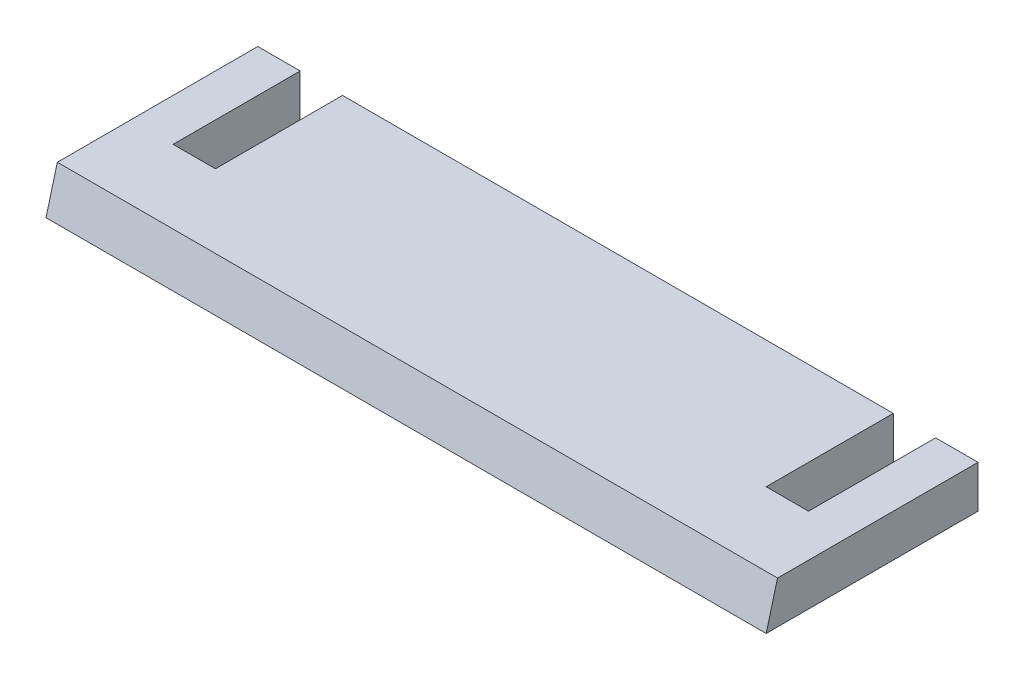
ISO-10303-21;
HEADER;
FILE_DESCRIPTION(('STEP AP214'),'2;1');
FILE_NAME('part.step','',(''),(''),'','','');
FILE_SCHEMA(('AUTOMOTIVE_DESIGN { 1 0 10303 214 1 1 1 1 }'));
ENDSEC;
DATA;
#1=APPLICATION_CONTEXT('core data for automotive mechanical design processes');
#2=APPLICATION_PROTOCOL_DEFINITION('international standard','automotive_design',2000,#1);
#3=PRODUCT_CONTEXT('',#1,'mechanical');
#4=PRODUCT('Part','Part','',(#3));
#5=PRODUCT_RELATED_PRODUCT_CATEGORY('part','',(#4));
#6=PRODUCT_DEFINITION_FORMATION('','',#4);
#7=PRODUCT_DEFINITION_CONTEXT('part definition',#1,'design');
#8=PRODUCT_DEFINITION('design','',#6,#7);
#9=PRODUCT_DEFINITION_SHAPE('','',#8);
#10=(LENGTH_UNIT() NAMED_UNIT(*) SI_UNIT(.MILLI.,.METRE.));
#11=(NAMED_UNIT(*) PLANE_ANGLE_UNIT() SI_UNIT($,.RADIAN.));
#12=(NAMED_UNIT(*) SI_UNIT($,.STERADIAN.) SOLID_ANGLE_UNIT());
#13=UNCERTAINTY_MEASURE_WITH_UNIT(LENGTH_MEASURE(1.E-05),#10,'distance_accuracy_value','');
#14=(GEOMETRIC_REPRESENTATION_CONTEXT(3) GLOBAL_UNCERTAINTY_ASSIGNED_CONTEXT((#13)) GLOBAL_UNIT_ASSIGNED_CONTEXT((#10,
#11,#12)) REPRESENTATION_CONTEXT('',''));
#15=CARTESIAN_POINT('',(0.,0.,0.));
#16=DIRECTION('',(0.,0.,1.));
#17=DIRECTION('',(1.,0.,0.));
#18=AXIS2_PLACEMENT_3D('',#15,#16,#17);
#19=CARTESIAN_POINT('',(170.,0.,0.));
#20=DIRECTION('',(0.,0.258819045102521,0.965925826289068));
#21=DIRECTION('',(0.,-0.965925826289068,0.258819045102521));
#22=AXIS2_PLACEMENT_3D('',#19,#20,#21);
#23=PLANE('',#22);
#24=DIRECTION('',(1.,0.,0.));
#25=VECTOR('',#24,1.);
#26=CARTESIAN_POINT('',(170.,0.,0.));
#27=LINE('',#26,#25);
#28=CARTESIAN_POINT('',(0.,0.,0.));
#29=VERTEX_POINT('',#28);
#30=CARTESIAN_POINT('',(170.,0.,0.));
#31=VERTEX_POINT('',#30);
#32=EDGE_CURVE('E132',#29,#31,#27,.T.);
#33=ORIENTED_EDGE('',*,*,#32,.T.);
#34=DIRECTION('',(0.,0.965925826289068,-0.258819045102521));
#35=VECTOR('',#34,1.);
#36=CARTESIAN_POINT('',(170.,21.8301270189222,-5.84936490538906));
#37=LINE('',#36,#35);
#38=CARTESIAN_POINT('',(170.,10.,-2.67949192431124));
#39=VERTEX_POINT('',#38);
#40=EDGE_CURVE('E11',#39,#31,#37,.F.);
#41=ORIENTED_EDGE('',*,*,#40,.F.);
#42=DIRECTION('',(-1.,0.,0.));
#43=VECTOR('',#42,1.);
#44=CARTESIAN_POINT('',(0.,10.,-2.67949192431123));
#45=LINE('',#44,#43);
#46=CARTESIAN_POINT('',(0.,10.,-2.67949192431123));
#47=VERTEX_POINT('',#46);
#48=EDGE_CURVE('E124',#47,#39,#45,.F.);
#49=ORIENTED_EDGE('',*,*,#48,.F.);
#50=DIRECTION('',(0.,0.965925826289068,-0.258819045102521));
#51=VECTOR('',#50,1.);
#52=CARTESIAN_POINT('',(0.,0.,0.));
#53=LINE('',#52,#51);
#54=EDGE_CURVE('E133',#47,#29,#53,.F.);
#55=ORIENTED_EDGE('',*,*,#54,.T.);
#56=EDGE_LOOP('',(#33,#41,#49,#55));
#57=FACE_BOUND('',#56,.T.);
#58=ADVANCED_FACE('F33',(#57),#23,.T.);
#59=CARTESIAN_POINT('',(170.,10.,-50.));
#60=DIRECTION('',(-1.,0.,0.));
#61=DIRECTION('',(0.,0.,1.));
#62=AXIS2_PLACEMENT_3D('',#59,#60,#61);
#63=PLANE('',#62);
#64=DIRECTION('',(0.,0.,-1.));
#65=VECTOR('',#64,1.);
#66=CARTESIAN_POINT('',(170.,0.,-50.));
#67=LINE('',#66,#65);
#68=CARTESIAN_POINT('',(170.,0.,-50.));
#69=VERTEX_POINT('',#68);
#70=EDGE_CURVE('E136',#31,#69,#67,.T.);
#71=ORIENTED_EDGE('',*,*,#70,.T.);
#72=DIRECTION('',(0.,-1.,0.));
#73=VECTOR('',#72,1.);
#74=CARTESIAN_POINT('',(170.,10.,-50.));
#75=LINE('',#74,#73);
#76=CARTESIAN_POINT('',(170.,10.,-50.));
#77=VERTEX_POINT('',#76);
#78=EDGE_CURVE('E41',#77,#69,#75,.T.);
#79=ORIENTED_EDGE('',*,*,#78,.F.);
#80=DIRECTION('',(0.,0.,-1.));
#81=VECTOR('',#80,1.);
#82=CARTESIAN_POINT('',(170.,10.,-50.));
#83=LINE('',#82,#81);
#84=EDGE_CURVE('E115',#39,#77,#83,.T.);
#85=ORIENTED_EDGE('',*,*,#84,.F.);
#86=ORIENTED_EDGE('',*,*,#40,.T.);
#87=EDGE_LOOP('',(#71,#79,#85,#86));
#88=FACE_BOUND('',#87,.T.);
#89=ADVANCED_FACE('F118',(#88),#63,.F.);
#90=CARTESIAN_POINT('',(160.,10.,-50.));
#91=DIRECTION('',(0.,0.,1.));
#92=DIRECTION('',(1.,0.,0.));
#93=AXIS2_PLACEMENT_3D('',#90,#91,#92);
#94=PLANE('',#93);
#95=DIRECTION('',(-1.,0.,0.));
#96=VECTOR('',#95,1.);
#97=CARTESIAN_POINT('',(160.,0.,-50.));
#98=LINE('',#97,#96);
#99=CARTESIAN_POINT('',(160.,0.,-50.));
#100=VERTEX_POINT('',#99);
#101=EDGE_CURVE('E138',#69,#100,#98,.T.);
#102=ORIENTED_EDGE('',*,*,#101,.T.);
#103=DIRECTION('',(0.,-1.,0.));
#104=VECTOR('',#103,1.);
#105=CARTESIAN_POINT('',(160.,10.,-50.));
#106=LINE('',#105,#104);
#107=CARTESIAN_POINT('',(160.,10.,-50.));
#108=VERTEX_POINT('',#107);
#109=EDGE_CURVE('E185',#108,#100,#106,.T.);
#110=ORIENTED_EDGE('',*,*,#109,.F.);
#111=DIRECTION('',(-1.,0.,0.));
#112=VECTOR('',#111,1.);
#113=CARTESIAN_POINT('',(160.,10.,-50.));
#114=LINE('',#113,#112);
#115=EDGE_CURVE('E123',#77,#108,#114,.T.);
#116=ORIENTED_EDGE('',*,*,#115,.F.);
#117=ORIENTED_EDGE('',*,*,#78,.T.);
#118=EDGE_LOOP('',(#102,#110,#116,#117));
#119=FACE_BOUND('',#118,.T.);
#120=ADVANCED_FACE('F211',(#119),#94,.F.);
#121=CARTESIAN_POINT('',(160.,10.,-20.));
#122=DIRECTION('',(1.,0.,0.));
#123=DIRECTION('',(0.,0.,-1.));
#124=AXIS2_PLACEMENT_3D('',#121,#122,#123);
#125=PLANE('',#124);
#126=DIRECTION('',(0.,0.,1.));
#127=VECTOR('',#126,1.);
#128=CARTESIAN_POINT('',(160.,0.,-20.));
#129=LINE('',#128,#127);
#130=CARTESIAN_POINT('',(160.,0.,-20.));
#131=VERTEX_POINT('',#130);
#132=EDGE_CURVE('E144',#100,#131,#129,.T.);
#133=ORIENTED_EDGE('',*,*,#132,.T.);
#134=DIRECTION('',(0.,-1.,0.));
#135=VECTOR('',#134,1.);
#136=CARTESIAN_POINT('',(160.,10.,-20.));
#137=LINE('',#136,#135);
#138=CARTESIAN_POINT('',(160.,10.,-20.));
#139=VERTEX_POINT('',#138);
#140=EDGE_CURVE('E182',#139,#131,#137,.T.);
#141=ORIENTED_EDGE('',*,*,#140,.F.);
#142=DIRECTION('',(0.,0.,1.));
#143=VECTOR('',#142,1.);
#144=CARTESIAN_POINT('',(160.,10.,-20.));
#145=LINE('',#144,#143);
#146=EDGE_CURVE('E205',#108,#139,#145,.T.);
#147=ORIENTED_EDGE('',*,*,#146,.F.);
#148=ORIENTED_EDGE('',*,*,#109,.T.);
#149=EDGE_LOOP('',(#133,#141,#147,#148));
#150=FACE_BOUND('',#149,.T.);
#151=ADVANCED_FACE('F215',(#150),#125,.F.);
#152=CARTESIAN_POINT('',(150.,10.,-20.));
#153=DIRECTION('',(0.,0.,1.));
#154=DIRECTION('',(1.,0.,0.));
#155=AXIS2_PLACEMENT_3D('',#152,#153,#154);
#156=PLANE('',#155);
#157=DIRECTION('',(-1.,0.,0.));
#158=VECTOR('',#157,1.);
#159=CARTESIAN_POINT('',(150.,0.,-20.));
#160=LINE('',#159,#158);
#161=CARTESIAN_POINT('',(150.,0.,-20.));
#162=VERTEX_POINT('',#161);
#163=EDGE_CURVE('E146',#131,#162,#160,.T.);
#164=ORIENTED_EDGE('',*,*,#163,.T.);
#165=DIRECTION('',(0.,-1.,0.));
#166=VECTOR('',#165,1.);
#167=CARTESIAN_POINT('',(150.,10.,-20.));
#168=LINE('',#167,#166);
#169=CARTESIAN_POINT('',(150.,10.,-20.));
#170=VERTEX_POINT('',#169);
#171=EDGE_CURVE('E179',#170,#162,#168,.T.);
#172=ORIENTED_EDGE('',*,*,#171,.F.);
#173=DIRECTION('',(-1.,0.,0.));
#174=VECTOR('',#173,1.);
#175=CARTESIAN_POINT('',(150.,10.,-20.));
#176=LINE('',#175,#174);
#177=EDGE_CURVE('E203',#139,#170,#176,.T.);
#178=ORIENTED_EDGE('',*,*,#177,.F.);
#179=ORIENTED_EDGE('',*,*,#140,.T.);
#180=EDGE_LOOP('',(#164,#172,#178,#179));
#181=FACE_BOUND('',#180,.T.);
#182=ADVANCED_FACE('F220',(#181),#156,.F.);
#183=CARTESIAN_POINT('',(150.,10.,-50.));
#184=DIRECTION('',(-1.,0.,0.));
#185=DIRECTION('',(0.,0.,1.));
#186=AXIS2_PLACEMENT_3D('',#183,#184,#185);
#187=PLANE('',#186);
#188=DIRECTION('',(0.,0.,-1.));
#189=VECTOR('',#188,1.);
#190=CARTESIAN_POINT('',(150.,0.,-50.));
#191=LINE('',#190,#189);
#192=CARTESIAN_POINT('',(150.,0.,-50.));
#193=VERTEX_POINT('',#192);
#194=EDGE_CURVE('E148',#162,#193,#191,.T.);
#195=ORIENTED_EDGE('',*,*,#194,.T.);
#196=DIRECTION('',(0.,-1.,0.));
#197=VECTOR('',#196,1.);
#198=CARTESIAN_POINT('',(150.,10.,-50.));
#199=LINE('',#198,#197);
#200=CARTESIAN_POINT('',(150.,10.,-50.));
#201=VERTEX_POINT('',#200);
#202=EDGE_CURVE('E176',#201,#193,#199,.T.);
#203=ORIENTED_EDGE('',*,*,#202,.F.);
#204=DIRECTION('',(0.,0.,-1.));
#205=VECTOR('',#204,1.);
#206=CARTESIAN_POINT('',(150.,10.,-50.));
#207=LINE('',#206,#205);
#208=EDGE_CURVE('E201',#170,#201,#207,.T.);
#209=ORIENTED_EDGE('',*,*,#208,.F.);
#210=ORIENTED_EDGE('',*,*,#171,.T.);
#211=EDGE_LOOP('',(#195,#203,#209,#210));
#212=FACE_BOUND('',#211,.T.);
#213=ADVANCED_FACE('F226',(#212),#187,.F.);
#214=CARTESIAN_POINT('',(20.,10.,-50.));
#215=DIRECTION('',(0.,0.,1.));
#216=DIRECTION('',(1.,0.,0.));
#217=AXIS2_PLACEMENT_3D('',#214,#215,#216);
#218=PLANE('',#217);
#219=DIRECTION('',(-1.,0.,0.));
#220=VECTOR('',#219,1.);
#221=CARTESIAN_POINT('',(20.,0.,-50.));
#222=LINE('',#221,#220);
#223=CARTESIAN_POINT('',(20.,0.,-50.));
#224=VERTEX_POINT('',#223);
#225=EDGE_CURVE('E150',#193,#224,#222,.T.);
#226=ORIENTED_EDGE('',*,*,#225,.T.);
#227=DIRECTION('',(0.,-1.,0.));
#228=VECTOR('',#227,1.);
#229=CARTESIAN_POINT('',(20.,10.,-50.));
#230=LINE('',#229,#228);
#231=CARTESIAN_POINT('',(20.,10.,-50.));
#232=VERTEX_POINT('',#231);
#233=EDGE_CURVE('E173',#232,#224,#230,.T.);
#234=ORIENTED_EDGE('',*,*,#233,.F.);
#235=DIRECTION('',(-1.,0.,0.));
#236=VECTOR('',#235,1.);
#237=CARTESIAN_POINT('',(20.,10.,-50.));
#238=LINE('',#237,#236);
#239=EDGE_CURVE('E199',#201,#232,#238,.T.);
#240=ORIENTED_EDGE('',*,*,#239,.F.);
#241=ORIENTED_EDGE('',*,*,#202,.T.);
#242=EDGE_LOOP('',(#226,#234,#240,#241));
#243=FACE_BOUND('',#242,.T.);
#244=ADVANCED_FACE('F230',(#243),#218,.F.);
#245=CARTESIAN_POINT('',(20.,10.,-20.));
#246=DIRECTION('',(1.,0.,0.));
#247=DIRECTION('',(0.,0.,-1.));
#248=AXIS2_PLACEMENT_3D('',#245,#246,#247);
#249=PLANE('',#248);
#250=DIRECTION('',(0.,0.,1.));
#251=VECTOR('',#250,1.);
#252=CARTESIAN_POINT('',(20.,0.,-20.));
#253=LINE('',#252,#251);
#254=CARTESIAN_POINT('',(20.,0.,-20.));
#255=VERTEX_POINT('',#254);
#256=EDGE_CURVE('E152',#224,#255,#253,.T.);
#257=ORIENTED_EDGE('',*,*,#256,.T.);
#258=DIRECTION('',(0.,-1.,0.));
#259=VECTOR('',#258,1.);
#260=CARTESIAN_POINT('',(20.,10.,-20.));
#261=LINE('',#260,#259);
#262=CARTESIAN_POINT('',(20.,10.,-20.));
#263=VERTEX_POINT('',#262);
#264=EDGE_CURVE('E170',#263,#255,#261,.T.);
#265=ORIENTED_EDGE('',*,*,#264,.F.);
#266=DIRECTION('',(0.,0.,1.));
#267=VECTOR('',#266,1.);
#268=CARTESIAN_POINT('',(20.,10.,-20.));
#269=LINE('',#268,#267);
#270=EDGE_CURVE('E197',#232,#263,#269,.T.);
#271=ORIENTED_EDGE('',*,*,#270,.F.);
#272=ORIENTED_EDGE('',*,*,#233,.T.);
#273=EDGE_LOOP('',(#257,#265,#271,#272));
#274=FACE_BOUND('',#273,.T.);
#275=ADVANCED_FACE('F235',(#274),#249,.F.);
#276=CARTESIAN_POINT('',(10.,10.,-20.));
#277=DIRECTION('',(0.,0.,1.));
#278=DIRECTION('',(1.,0.,0.));
#279=AXIS2_PLACEMENT_3D('',#276,#277,#278);
#280=PLANE('',#279);
#281=DIRECTION('',(-1.,0.,0.));
#282=VECTOR('',#281,1.);
#283=CARTESIAN_POINT('',(10.,0.,-20.));
#284=LINE('',#283,#282);
#285=CARTESIAN_POINT('',(10.,0.,-20.));
#286=VERTEX_POINT('',#285);
#287=EDGE_CURVE('E154',#255,#286,#284,.T.);
#288=ORIENTED_EDGE('',*,*,#287,.T.);
#289=DIRECTION('',(0.,-1.,0.));
#290=VECTOR('',#289,1.);
#291=CARTESIAN_POINT('',(10.,10.,-20.));
#292=LINE('',#291,#290);
#293=CARTESIAN_POINT('',(10.,10.,-20.));
#294=VERTEX_POINT('',#293);
#295=EDGE_CURVE('E167',#294,#286,#292,.T.);
#296=ORIENTED_EDGE('',*,*,#295,.F.);
#297=DIRECTION('',(-1.,0.,0.));
#298=VECTOR('',#297,1.);
#299=CARTESIAN_POINT('',(10.,10.,-20.));
#300=LINE('',#299,#298);
#301=EDGE_CURVE('E193',#263,#294,#300,.T.);
#302=ORIENTED_EDGE('',*,*,#301,.F.);
#303=ORIENTED_EDGE('',*,*,#264,.T.);
#304=EDGE_LOOP('',(#288,#296,#302,#303));
#305=FACE_BOUND('',#304,.T.);
#306=ADVANCED_FACE('F241',(#305),#280,.F.);
#307=CARTESIAN_POINT('',(10.,10.,-50.));
#308=DIRECTION('',(-1.,0.,0.));
#309=DIRECTION('',(0.,0.,1.));
#310=AXIS2_PLACEMENT_3D('',#307,#308,#309);
#311=PLANE('',#310);
#312=DIRECTION('',(0.,0.,-1.));
#313=VECTOR('',#312,1.);
#314=CARTESIAN_POINT('',(10.,0.,-50.));
#315=LINE('',#314,#313);
#316=CARTESIAN_POINT('',(10.,0.,-50.));
#317=VERTEX_POINT('',#316);
#318=EDGE_CURVE('E156',#286,#317,#315,.T.);
#319=ORIENTED_EDGE('',*,*,#318,.T.);
#320=DIRECTION('',(0.,-1.,0.));
#321=VECTOR('',#320,1.);
#322=CARTESIAN_POINT('',(10.,10.,-50.));
#323=LINE('',#322,#321);
#324=CARTESIAN_POINT('',(10.,10.,-50.));
#325=VERTEX_POINT('',#324);
#326=EDGE_CURVE('E164',#325,#317,#323,.T.);
#327=ORIENTED_EDGE('',*,*,#326,.F.);
#328=DIRECTION('',(0.,0.,-1.));
#329=VECTOR('',#328,1.);
#330=CARTESIAN_POINT('',(10.,10.,-50.));
#331=LINE('',#330,#329);
#332=EDGE_CURVE('E190',#294,#325,#331,.T.);
#333=ORIENTED_EDGE('',*,*,#332,.F.);
#334=ORIENTED_EDGE('',*,*,#295,.T.);
#335=EDGE_LOOP('',(#319,#327,#333,#334));
#336=FACE_BOUND('',#335,.T.);
#337=ADVANCED_FACE('F245',(#336),#311,.F.);
#338=CARTESIAN_POINT('',(0.,10.,-50.));
#339=DIRECTION('',(0.,0.,1.));
#340=DIRECTION('',(1.,0.,0.));
#341=AXIS2_PLACEMENT_3D('',#338,#339,#340);
#342=PLANE('',#341);
#343=DIRECTION('',(-1.,0.,0.));
#344=VECTOR('',#343,1.);
#345=CARTESIAN_POINT('',(0.,0.,-50.));
#346=LINE('',#345,#344);
#347=CARTESIAN_POINT('',(0.,0.,-50.));
#348=VERTEX_POINT('',#347);
#349=EDGE_CURVE('E158',#317,#348,#346,.T.);
#350=ORIENTED_EDGE('',*,*,#349,.T.);
#351=DIRECTION('',(0.,-1.,0.));
#352=VECTOR('',#351,1.);
#353=CARTESIAN_POINT('',(0.,10.,-50.));
#354=LINE('',#353,#352);
#355=CARTESIAN_POINT('',(0.,10.,-50.));
#356=VERTEX_POINT('',#355);
#357=EDGE_CURVE('E161',#356,#348,#354,.T.);
#358=ORIENTED_EDGE('',*,*,#357,.F.);
#359=DIRECTION('',(-1.,0.,0.));
#360=VECTOR('',#359,1.);
#361=CARTESIAN_POINT('',(0.,10.,-50.));
#362=LINE('',#361,#360);
#363=EDGE_CURVE('E189',#325,#356,#362,.T.);
#364=ORIENTED_EDGE('',*,*,#363,.F.);
#365=ORIENTED_EDGE('',*,*,#326,.T.);
#366=EDGE_LOOP('',(#350,#358,#364,#365));
#367=FACE_BOUND('',#366,.T.);
#368=ADVANCED_FACE('F248',(#367),#342,.F.);
#369=CARTESIAN_POINT('',(0.,10.,0.));
#370=DIRECTION('',(1.,0.,0.));
#371=DIRECTION('',(0.,0.,-1.));
#372=AXIS2_PLACEMENT_3D('',#369,#370,#371);
#373=PLANE('',#372);
#374=DIRECTION('',(0.,0.,1.));
#375=VECTOR('',#374,1.);
#376=CARTESIAN_POINT('',(0.,0.,0.));
#377=LINE('',#376,#375);
#378=EDGE_CURVE('E130',#348,#29,#377,.T.);
#379=ORIENTED_EDGE('',*,*,#378,.T.);
#380=ORIENTED_EDGE('',*,*,#54,.F.);
#381=DIRECTION('',(0.,0.,1.));
#382=VECTOR('',#381,1.);
#383=CARTESIAN_POINT('',(0.,10.,0.));
#384=LINE('',#383,#382);
#385=EDGE_CURVE('E48',#356,#47,#384,.T.);
#386=ORIENTED_EDGE('',*,*,#385,.F.);
#387=ORIENTED_EDGE('',*,*,#357,.T.);
#388=EDGE_LOOP('',(#379,#380,#386,#387));
#389=FACE_BOUND('',#388,.T.);
#390=ADVANCED_FACE('F250',(#389),#373,.F.);
#391=CARTESIAN_POINT('',(0.,10.,0.));
#392=DIRECTION('',(0.,-1.,0.));
#393=DIRECTION('',(0.,0.,-1.));
#394=AXIS2_PLACEMENT_3D('',#391,#392,#393);
#395=PLANE('',#394);
#396=ORIENTED_EDGE('',*,*,#48,.T.);
#397=ORIENTED_EDGE('',*,*,#84,.T.);
#398=ORIENTED_EDGE('',*,*,#115,.T.);
#399=ORIENTED_EDGE('',*,*,#146,.T.);
#400=ORIENTED_EDGE('',*,*,#177,.T.);
#401=ORIENTED_EDGE('',*,*,#208,.T.);
#402=ORIENTED_EDGE('',*,*,#239,.T.);
#403=ORIENTED_EDGE('',*,*,#270,.T.);
#404=ORIENTED_EDGE('',*,*,#301,.T.);
#405=ORIENTED_EDGE('',*,*,#332,.T.);
#406=ORIENTED_EDGE('',*,*,#363,.T.);
#407=ORIENTED_EDGE('',*,*,#385,.T.);
#408=EDGE_LOOP('',(#396,#397,#398,#399,#400,#401,#402,#403,#404,#405,#406,#407));
#409=FACE_BOUND('',#408,.T.);
#410=ADVANCED_FACE('F127',(#409),#395,.F.);
#411=CARTESIAN_POINT('',(0.,0.,0.));
#412=DIRECTION('',(0.,-1.,0.));
#413=DIRECTION('',(0.,0.,-1.));
#414=AXIS2_PLACEMENT_3D('',#411,#412,#413);
#415=PLANE('',#414);
#416=ORIENTED_EDGE('',*,*,#32,.F.);
#417=ORIENTED_EDGE('',*,*,#378,.F.);
#418=ORIENTED_EDGE('',*,*,#349,.F.);
#419=ORIENTED_EDGE('',*,*,#318,.F.);
#420=ORIENTED_EDGE('',*,*,#287,.F.);
#421=ORIENTED_EDGE('',*,*,#256,.F.);
#422=ORIENTED_EDGE('',*,*,#225,.F.);
#423=ORIENTED_EDGE('',*,*,#194,.F.);
#424=ORIENTED_EDGE('',*,*,#163,.F.);
#425=ORIENTED_EDGE('',*,*,#132,.F.);
#426=ORIENTED_EDGE('',*,*,#101,.F.);
#427=ORIENTED_EDGE('',*,*,#70,.F.);
#428=EDGE_LOOP('',(#416,#417,#418,#419,#420,#421,#422,#423,#424,#425,#426,#427));
#429=FACE_BOUND('',#428,.T.);
#430=ADVANCED_FACE('F251',(#429),#415,.T.);
#431=CLOSED_SHELL('',(#58,#89,#120,#151,#182,#213,#244,#275,#306,#337,#368,#390,#410,#430));
#432=MANIFOLD_SOLID_BREP('B2',#431);
#433=ADVANCED_BREP_SHAPE_REPRESENTATION('',(#18,#432),#14);
#434=SHAPE_DEFINITION_REPRESENTATION(#9,#433);
ENDSEC;
END-ISO-10303-21;
